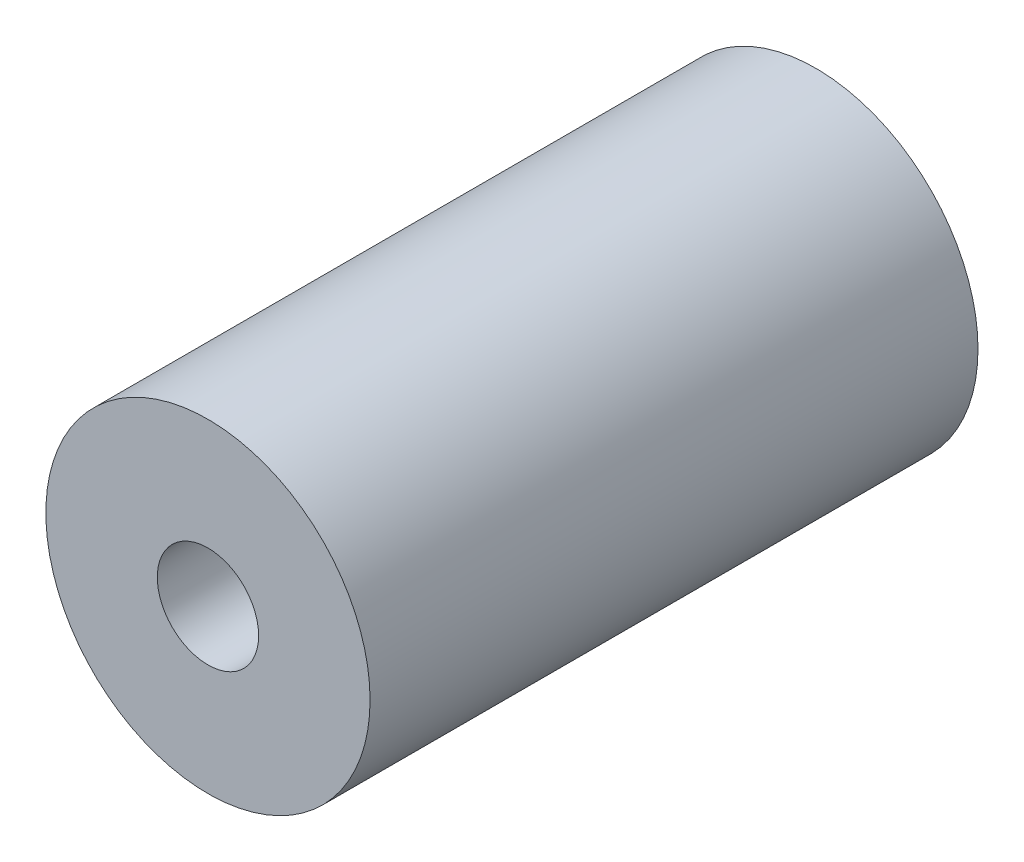
ISO-10303-21;
HEADER;
FILE_DESCRIPTION(('STEP AP214'),'2;1');
FILE_NAME('part.step','',(''),(''),'','','');
FILE_SCHEMA(('AUTOMOTIVE_DESIGN { 1 0 10303 214 1 1 1 1 }'));
ENDSEC;
DATA;
#1=APPLICATION_CONTEXT('core data for automotive mechanical design processes');
#2=APPLICATION_PROTOCOL_DEFINITION('international standard','automotive_design',2000,#1);
#3=PRODUCT_CONTEXT('',#1,'mechanical');
#4=PRODUCT('Part','Part','',(#3));
#5=PRODUCT_RELATED_PRODUCT_CATEGORY('part','',(#4));
#6=PRODUCT_DEFINITION_FORMATION('','',#4);
#7=PRODUCT_DEFINITION_CONTEXT('part definition',#1,'design');
#8=PRODUCT_DEFINITION('design','',#6,#7);
#9=PRODUCT_DEFINITION_SHAPE('','',#8);
#10=(LENGTH_UNIT() NAMED_UNIT(*) SI_UNIT(.MILLI.,.METRE.));
#11=(NAMED_UNIT(*) PLANE_ANGLE_UNIT() SI_UNIT($,.RADIAN.));
#12=(NAMED_UNIT(*) SI_UNIT($,.STERADIAN.) SOLID_ANGLE_UNIT());
#13=UNCERTAINTY_MEASURE_WITH_UNIT(LENGTH_MEASURE(1.E-05),#10,'distance_accuracy_value','');
#14=(GEOMETRIC_REPRESENTATION_CONTEXT(3) GLOBAL_UNCERTAINTY_ASSIGNED_CONTEXT((#13)) GLOBAL_UNIT_ASSIGNED_CONTEXT((#10,
#11,#12)) REPRESENTATION_CONTEXT('',''));
#15=CARTESIAN_POINT('',(0.,0.,0.));
#16=DIRECTION('',(0.,0.,1.));
#17=DIRECTION('',(1.,0.,0.));
#18=AXIS2_PLACEMENT_3D('',#15,#16,#17);
#19=CARTESIAN_POINT('',(0.,0.,15.));
#20=DIRECTION('',(0.,0.,1.));
#21=DIRECTION('',(1.,0.,0.));
#22=AXIS2_PLACEMENT_3D('',#19,#20,#21);
#23=PLANE('',#22);
#24=CARTESIAN_POINT('',(0.,0.,15.));
#25=DIRECTION('',(0.,0.,1.));
#26=DIRECTION('',(1.,0.,0.));
#27=AXIS2_PLACEMENT_3D('',#24,#25,#26);
#28=CIRCLE('',#27,4.);
#29=CARTESIAN_POINT('',(4.,0.,15.));
#30=VERTEX_POINT('',#29);
#31=EDGE_CURVE('E10',#30,#30,#28,.T.);
#32=ORIENTED_EDGE('',*,*,#31,.T.);
#33=EDGE_LOOP('',(#32));
#34=FACE_BOUND('',#33,.T.);
#35=CARTESIAN_POINT('',(0.,0.,15.));
#36=DIRECTION('',(0.,0.,1.));
#37=DIRECTION('',(1.,0.,0.));
#38=AXIS2_PLACEMENT_3D('',#35,#36,#37);
#39=CIRCLE('',#38,1.25);
#40=CARTESIAN_POINT('',(1.25,0.,15.));
#41=VERTEX_POINT('',#40);
#42=EDGE_CURVE('E26',#41,#41,#39,.T.);
#43=ORIENTED_EDGE('',*,*,#42,.F.);
#44=EDGE_LOOP('',(#43));
#45=FACE_BOUND('',#44,.T.);
#46=ADVANCED_FACE('F15',(#34,#45),#23,.T.);
#47=CARTESIAN_POINT('',(0.,0.,0.));
#48=DIRECTION('',(0.,0.,1.));
#49=DIRECTION('',(1.,0.,0.));
#50=AXIS2_PLACEMENT_3D('',#47,#48,#49);
#51=PLANE('',#50);
#52=CARTESIAN_POINT('',(0.,0.,0.));
#53=DIRECTION('',(0.,0.,1.));
#54=DIRECTION('',(1.,0.,0.));
#55=AXIS2_PLACEMENT_3D('',#52,#53,#54);
#56=CIRCLE('',#55,4.);
#57=CARTESIAN_POINT('',(4.,0.,0.));
#58=VERTEX_POINT('',#57);
#59=EDGE_CURVE('E19',#58,#58,#56,.T.);
#60=ORIENTED_EDGE('',*,*,#59,.F.);
#61=EDGE_LOOP('',(#60));
#62=FACE_BOUND('',#61,.T.);
#63=CARTESIAN_POINT('',(0.,0.,0.));
#64=DIRECTION('',(0.,0.,1.));
#65=DIRECTION('',(1.,0.,0.));
#66=AXIS2_PLACEMENT_3D('',#63,#64,#65);
#67=CIRCLE('',#66,1.25);
#68=CARTESIAN_POINT('',(1.25,0.,0.));
#69=VERTEX_POINT('',#68);
#70=EDGE_CURVE('E28',#69,#69,#67,.T.);
#71=ORIENTED_EDGE('',*,*,#70,.T.);
#72=EDGE_LOOP('',(#71));
#73=FACE_BOUND('',#72,.T.);
#74=ADVANCED_FACE('F38',(#62,#73),#51,.F.);
#75=CARTESIAN_POINT('',(0.,0.,15.));
#76=DIRECTION('',(0.,0.,-1.));
#77=DIRECTION('',(-1.,0.,0.));
#78=AXIS2_PLACEMENT_3D('',#75,#76,#77);
#79=CYLINDRICAL_SURFACE('',#78,4.);
#80=ORIENTED_EDGE('',*,*,#31,.F.);
#81=EDGE_LOOP('',(#80));
#82=FACE_BOUND('',#81,.T.);
#83=ORIENTED_EDGE('',*,*,#59,.T.);
#84=EDGE_LOOP('',(#83));
#85=FACE_BOUND('',#84,.T.);
#86=ADVANCED_FACE('F17',(#82,#85),#79,.T.);
#87=CARTESIAN_POINT('',(0.,0.,15.));
#88=DIRECTION('',(0.,0.,-1.));
#89=DIRECTION('',(-1.,0.,0.));
#90=AXIS2_PLACEMENT_3D('',#87,#88,#89);
#91=CYLINDRICAL_SURFACE('',#90,1.25);
#92=ORIENTED_EDGE('',*,*,#42,.T.);
#93=EDGE_LOOP('',(#92));
#94=FACE_BOUND('',#93,.T.);
#95=ORIENTED_EDGE('',*,*,#70,.F.);
#96=EDGE_LOOP('',(#95));
#97=FACE_BOUND('',#96,.T.);
#98=ADVANCED_FACE('F34',(#94,#97),#91,.F.);
#99=CLOSED_SHELL('',(#46,#74,#86,#98));
#100=MANIFOLD_SOLID_BREP('B1',#99);
#101=ADVANCED_BREP_SHAPE_REPRESENTATION('',(#18,#100),#14);
#102=SHAPE_DEFINITION_REPRESENTATION(#9,#101);
ENDSEC;
END-ISO-10303-21;
